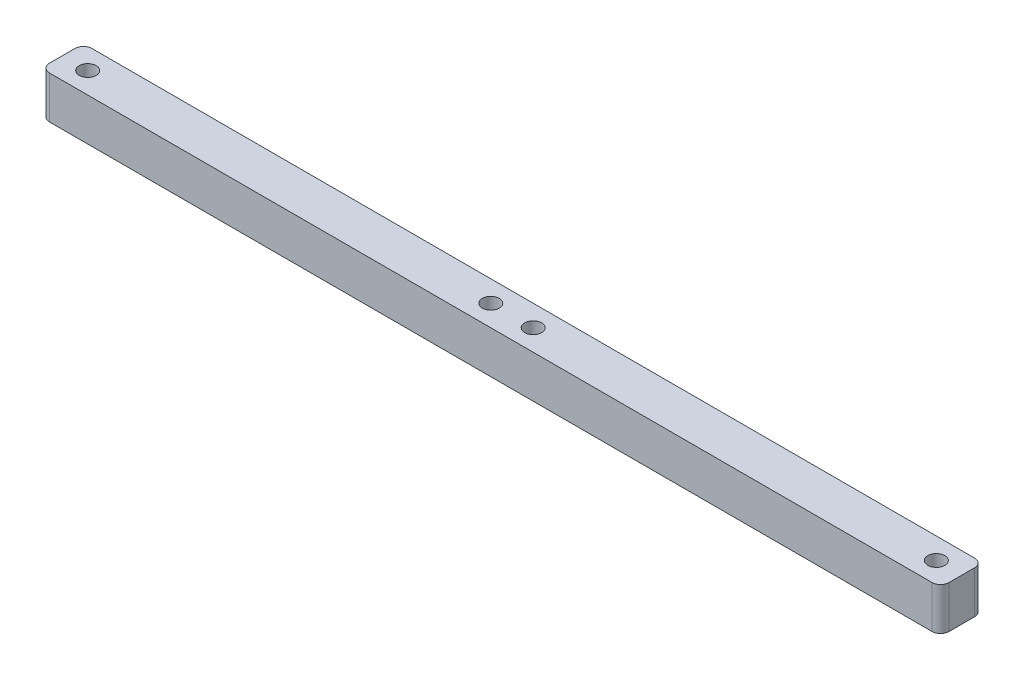
ISO-10303-21;
HEADER;
FILE_DESCRIPTION(('STEP AP214'),'2;1');
FILE_NAME('part.step','',(''),(''),'','','');
FILE_SCHEMA(('AUTOMOTIVE_DESIGN { 1 0 10303 214 1 1 1 1 }'));
ENDSEC;
DATA;
#1=APPLICATION_CONTEXT('core data for automotive mechanical design processes');
#2=APPLICATION_PROTOCOL_DEFINITION('international standard','automotive_design',2000,#1);
#3=PRODUCT_CONTEXT('',#1,'mechanical');
#4=PRODUCT('Part','Part','',(#3));
#5=PRODUCT_RELATED_PRODUCT_CATEGORY('part','',(#4));
#6=PRODUCT_DEFINITION_FORMATION('','',#4);
#7=PRODUCT_DEFINITION_CONTEXT('part definition',#1,'design');
#8=PRODUCT_DEFINITION('design','',#6,#7);
#9=PRODUCT_DEFINITION_SHAPE('','',#8);
#10=(LENGTH_UNIT() NAMED_UNIT(*) SI_UNIT(.MILLI.,.METRE.));
#11=(NAMED_UNIT(*) PLANE_ANGLE_UNIT() SI_UNIT($,.RADIAN.));
#12=(NAMED_UNIT(*) SI_UNIT($,.STERADIAN.) SOLID_ANGLE_UNIT());
#13=UNCERTAINTY_MEASURE_WITH_UNIT(LENGTH_MEASURE(1.E-05),#10,'distance_accuracy_value','');
#14=(GEOMETRIC_REPRESENTATION_CONTEXT(3) GLOBAL_UNCERTAINTY_ASSIGNED_CONTEXT((#13)) GLOBAL_UNIT_ASSIGNED_CONTEXT((#10,
#11,#12)) REPRESENTATION_CONTEXT('',''));
#15=CARTESIAN_POINT('',(0.,0.,0.));
#16=DIRECTION('',(0.,0.,1.));
#17=DIRECTION('',(1.,0.,0.));
#18=AXIS2_PLACEMENT_3D('',#15,#16,#17);
#19=CARTESIAN_POINT('',(53.,5.,-2.5));
#20=DIRECTION('',(-1.,0.,0.));
#21=DIRECTION('',(0.,0.,1.));
#22=AXIS2_PLACEMENT_3D('',#19,#20,#21);
#23=PLANE('',#22);
#24=DIRECTION('',(0.,0.,-1.));
#25=VECTOR('',#24,1.);
#26=CARTESIAN_POINT('',(53.,0.,-2.5));
#27=LINE('',#26,#25);
#28=CARTESIAN_POINT('',(53.,0.,1.5));
#29=VERTEX_POINT('',#28);
#30=CARTESIAN_POINT('',(53.,0.,-1.5));
#31=VERTEX_POINT('',#30);
#32=EDGE_CURVE('E134',#29,#31,#27,.T.);
#33=ORIENTED_EDGE('',*,*,#32,.T.);
#34=DIRECTION('',(0.,-1.,0.));
#35=VECTOR('',#34,1.);
#36=CARTESIAN_POINT('',(53.,5.,-1.5));
#37=LINE('',#36,#35);
#38=CARTESIAN_POINT('',(53.,5.,-1.5));
#39=VERTEX_POINT('',#38);
#40=EDGE_CURVE('E58',#31,#39,#37,.F.);
#41=ORIENTED_EDGE('',*,*,#40,.T.);
#42=DIRECTION('',(0.,0.,-1.));
#43=VECTOR('',#42,1.);
#44=CARTESIAN_POINT('',(53.,5.,-2.5));
#45=LINE('',#44,#43);
#46=CARTESIAN_POINT('',(53.,5.,1.5));
#47=VERTEX_POINT('',#46);
#48=EDGE_CURVE('E132',#47,#39,#45,.T.);
#49=ORIENTED_EDGE('',*,*,#48,.F.);
#50=DIRECTION('',(0.,-1.,0.));
#51=VECTOR('',#50,1.);
#52=CARTESIAN_POINT('',(53.,5.,1.5));
#53=LINE('',#52,#51);
#54=EDGE_CURVE('E156',#47,#29,#53,.T.);
#55=ORIENTED_EDGE('',*,*,#54,.T.);
#56=EDGE_LOOP('',(#33,#41,#49,#55));
#57=FACE_BOUND('',#56,.T.);
#58=ADVANCED_FACE('F37',(#57),#23,.F.);
#59=CARTESIAN_POINT('',(-53.,5.,-2.5));
#60=DIRECTION('',(0.,0.,1.));
#61=DIRECTION('',(1.,0.,0.));
#62=AXIS2_PLACEMENT_3D('',#59,#60,#61);
#63=PLANE('',#62);
#64=DIRECTION('',(-1.,0.,0.));
#65=VECTOR('',#64,1.);
#66=CARTESIAN_POINT('',(-53.,5.,-2.5));
#67=LINE('',#66,#65);
#68=CARTESIAN_POINT('',(52.,5.,-2.5));
#69=VERTEX_POINT('',#68);
#70=CARTESIAN_POINT('',(-52.,5.,-2.5));
#71=VERTEX_POINT('',#70);
#72=EDGE_CURVE('E165',#69,#71,#67,.T.);
#73=ORIENTED_EDGE('',*,*,#72,.F.);
#74=DIRECTION('',(0.,-1.,0.));
#75=VECTOR('',#74,1.);
#76=CARTESIAN_POINT('',(52.,5.,-2.5));
#77=LINE('',#76,#75);
#78=CARTESIAN_POINT('',(52.,0.,-2.5));
#79=VERTEX_POINT('',#78);
#80=EDGE_CURVE('E149',#69,#79,#77,.T.);
#81=ORIENTED_EDGE('',*,*,#80,.T.);
#82=DIRECTION('',(-1.,0.,0.));
#83=VECTOR('',#82,1.);
#84=CARTESIAN_POINT('',(-53.,0.,-2.5));
#85=LINE('',#84,#83);
#86=CARTESIAN_POINT('',(-52.,0.,-2.5));
#87=VERTEX_POINT('',#86);
#88=EDGE_CURVE('E130',#79,#87,#85,.T.);
#89=ORIENTED_EDGE('',*,*,#88,.T.);
#90=DIRECTION('',(0.,-1.,0.));
#91=VECTOR('',#90,1.);
#92=CARTESIAN_POINT('',(-52.,5.,-2.5));
#93=LINE('',#92,#91);
#94=EDGE_CURVE('E111',#87,#71,#93,.F.);
#95=ORIENTED_EDGE('',*,*,#94,.T.);
#96=EDGE_LOOP('',(#73,#81,#89,#95));
#97=FACE_BOUND('',#96,.T.);
#98=ADVANCED_FACE('F169',(#97),#63,.F.);
#99=CARTESIAN_POINT('',(-53.,5.,-2.5));
#100=DIRECTION('',(1.,0.,0.));
#101=DIRECTION('',(0.,0.,-1.));
#102=AXIS2_PLACEMENT_3D('',#99,#100,#101);
#103=PLANE('',#102);
#104=DIRECTION('',(0.,0.,1.));
#105=VECTOR('',#104,1.);
#106=CARTESIAN_POINT('',(-53.,5.,-2.5));
#107=LINE('',#106,#105);
#108=CARTESIAN_POINT('',(-53.,5.,-1.5));
#109=VERTEX_POINT('',#108);
#110=CARTESIAN_POINT('',(-53.,5.,1.5));
#111=VERTEX_POINT('',#110);
#112=EDGE_CURVE('E124',#109,#111,#107,.T.);
#113=ORIENTED_EDGE('',*,*,#112,.F.);
#114=DIRECTION('',(0.,-1.,0.));
#115=VECTOR('',#114,1.);
#116=CARTESIAN_POINT('',(-53.,5.,-1.5));
#117=LINE('',#116,#115);
#118=CARTESIAN_POINT('',(-53.,0.,-1.5));
#119=VERTEX_POINT('',#118);
#120=EDGE_CURVE('E109',#109,#119,#117,.T.);
#121=ORIENTED_EDGE('',*,*,#120,.T.);
#122=DIRECTION('',(0.,0.,1.));
#123=VECTOR('',#122,1.);
#124=CARTESIAN_POINT('',(-53.,0.,-2.5));
#125=LINE('',#124,#123);
#126=CARTESIAN_POINT('',(-53.,0.,1.5));
#127=VERTEX_POINT('',#126);
#128=EDGE_CURVE('E121',#119,#127,#125,.T.);
#129=ORIENTED_EDGE('',*,*,#128,.T.);
#130=DIRECTION('',(0.,-1.,0.));
#131=VECTOR('',#130,1.);
#132=CARTESIAN_POINT('',(-53.,5.,1.5));
#133=LINE('',#132,#131);
#134=EDGE_CURVE('E125',#127,#111,#133,.F.);
#135=ORIENTED_EDGE('',*,*,#134,.T.);
#136=EDGE_LOOP('',(#113,#121,#129,#135));
#137=FACE_BOUND('',#136,.T.);
#138=ADVANCED_FACE('F120',(#137),#103,.F.);
#139=CARTESIAN_POINT('',(-53.,5.,2.5));
#140=DIRECTION('',(0.,0.,-1.));
#141=DIRECTION('',(-1.,0.,0.));
#142=AXIS2_PLACEMENT_3D('',#139,#140,#141);
#143=PLANE('',#142);
#144=DIRECTION('',(1.,0.,0.));
#145=VECTOR('',#144,1.);
#146=CARTESIAN_POINT('',(-53.,0.,2.5));
#147=LINE('',#146,#145);
#148=CARTESIAN_POINT('',(-52.,0.,2.5));
#149=VERTEX_POINT('',#148);
#150=CARTESIAN_POINT('',(52.,0.,2.5));
#151=VERTEX_POINT('',#150);
#152=EDGE_CURVE('E129',#149,#151,#147,.T.);
#153=ORIENTED_EDGE('',*,*,#152,.T.);
#154=DIRECTION('',(0.,-1.,0.));
#155=VECTOR('',#154,1.);
#156=CARTESIAN_POINT('',(52.,5.,2.5));
#157=LINE('',#156,#155);
#158=CARTESIAN_POINT('',(52.,5.,2.5));
#159=VERTEX_POINT('',#158);
#160=EDGE_CURVE('E11',#151,#159,#157,.F.);
#161=ORIENTED_EDGE('',*,*,#160,.T.);
#162=DIRECTION('',(1.,0.,0.));
#163=VECTOR('',#162,1.);
#164=CARTESIAN_POINT('',(-53.,5.,2.5));
#165=LINE('',#164,#163);
#166=CARTESIAN_POINT('',(-52.,5.,2.5));
#167=VERTEX_POINT('',#166);
#168=EDGE_CURVE('E138',#167,#159,#165,.T.);
#169=ORIENTED_EDGE('',*,*,#168,.F.);
#170=DIRECTION('',(0.,-1.,0.));
#171=VECTOR('',#170,1.);
#172=CARTESIAN_POINT('',(-52.,5.,2.5));
#173=LINE('',#172,#171);
#174=EDGE_CURVE('E146',#167,#149,#173,.T.);
#175=ORIENTED_EDGE('',*,*,#174,.T.);
#176=EDGE_LOOP('',(#153,#161,#169,#175));
#177=FACE_BOUND('',#176,.T.);
#178=ADVANCED_FACE('F207',(#177),#143,.F.);
#179=CARTESIAN_POINT('',(0.,5.,0.));
#180=DIRECTION('',(0.,1.,0.));
#181=DIRECTION('',(0.,0.,1.));
#182=AXIS2_PLACEMENT_3D('',#179,#180,#181);
#183=PLANE('',#182);
#184=CARTESIAN_POINT('',(-50.,5.,0.));
#185=DIRECTION('',(0.,1.,0.));
#186=DIRECTION('',(0.,0.,1.));
#187=AXIS2_PLACEMENT_3D('',#184,#185,#186);
#188=CIRCLE('',#187,0.999999999999998);
#189=CARTESIAN_POINT('',(-50.,5.,0.999999999999999));
#190=VERTEX_POINT('',#189);
#191=EDGE_CURVE('E176',#190,#190,#188,.T.);
#192=ORIENTED_EDGE('',*,*,#191,.F.);
#193=EDGE_LOOP('',(#192));
#194=FACE_BOUND('',#193,.T.);
#195=CARTESIAN_POINT('',(2.5,5.,0.));
#196=DIRECTION('',(0.,1.,0.));
#197=DIRECTION('',(0.,0.,1.));
#198=AXIS2_PLACEMENT_3D('',#195,#196,#197);
#199=CIRCLE('',#198,1.);
#200=CARTESIAN_POINT('',(2.5,5.,0.999999999999999));
#201=VERTEX_POINT('',#200);
#202=EDGE_CURVE('E186',#201,#201,#199,.T.);
#203=ORIENTED_EDGE('',*,*,#202,.F.);
#204=EDGE_LOOP('',(#203));
#205=FACE_BOUND('',#204,.T.);
#206=CARTESIAN_POINT('',(-2.5,5.,0.));
#207=DIRECTION('',(0.,1.,0.));
#208=DIRECTION('',(0.,0.,1.));
#209=AXIS2_PLACEMENT_3D('',#206,#207,#208);
#210=CIRCLE('',#209,1.);
#211=CARTESIAN_POINT('',(-2.5,5.,1.));
#212=VERTEX_POINT('',#211);
#213=EDGE_CURVE('E185',#212,#212,#210,.T.);
#214=ORIENTED_EDGE('',*,*,#213,.F.);
#215=EDGE_LOOP('',(#214));
#216=FACE_BOUND('',#215,.T.);
#217=CARTESIAN_POINT('',(50.,5.,0.));
#218=DIRECTION('',(0.,1.,0.));
#219=DIRECTION('',(0.,0.,1.));
#220=AXIS2_PLACEMENT_3D('',#217,#218,#219);
#221=CIRCLE('',#220,0.999999999999998);
#222=CARTESIAN_POINT('',(50.,5.,0.999999999999998));
#223=VERTEX_POINT('',#222);
#224=EDGE_CURVE('E192',#223,#223,#221,.T.);
#225=ORIENTED_EDGE('',*,*,#224,.F.);
#226=EDGE_LOOP('',(#225));
#227=FACE_BOUND('',#226,.T.);
#228=ORIENTED_EDGE('',*,*,#48,.T.);
#229=CARTESIAN_POINT('',(52.,5.,-1.5));
#230=DIRECTION('',(0.,1.,0.));
#231=DIRECTION('',(0.,0.,1.));
#232=AXIS2_PLACEMENT_3D('',#229,#230,#231);
#233=CIRCLE('',#232,1.);
#234=EDGE_CURVE('E45',#39,#69,#233,.T.);
#235=ORIENTED_EDGE('',*,*,#234,.T.);
#236=ORIENTED_EDGE('',*,*,#72,.T.);
#237=CARTESIAN_POINT('',(-52.,5.,-1.5));
#238=DIRECTION('',(0.,1.,0.));
#239=DIRECTION('',(0.,0.,1.));
#240=AXIS2_PLACEMENT_3D('',#237,#238,#239);
#241=CIRCLE('',#240,1.);
#242=EDGE_CURVE('E144',#71,#109,#241,.T.);
#243=ORIENTED_EDGE('',*,*,#242,.T.);
#244=ORIENTED_EDGE('',*,*,#112,.T.);
#245=CARTESIAN_POINT('',(-52.,5.,1.5));
#246=DIRECTION('',(0.,1.,0.));
#247=DIRECTION('',(0.,0.,1.));
#248=AXIS2_PLACEMENT_3D('',#245,#246,#247);
#249=CIRCLE('',#248,1.);
#250=EDGE_CURVE('E142',#111,#167,#249,.T.);
#251=ORIENTED_EDGE('',*,*,#250,.T.);
#252=ORIENTED_EDGE('',*,*,#168,.T.);
#253=CARTESIAN_POINT('',(52.,5.,1.5));
#254=DIRECTION('',(0.,1.,0.));
#255=DIRECTION('',(0.,0.,1.));
#256=AXIS2_PLACEMENT_3D('',#253,#254,#255);
#257=CIRCLE('',#256,1.);
#258=EDGE_CURVE('E160',#159,#47,#257,.T.);
#259=ORIENTED_EDGE('',*,*,#258,.T.);
#260=EDGE_LOOP('',(#228,#235,#236,#243,#244,#251,#252,#259));
#261=FACE_BOUND('',#260,.T.);
#262=ADVANCED_FACE('F164',(#194,#205,#216,#227,#261),#183,.T.);
#263=CARTESIAN_POINT('',(0.,0.,0.));
#264=DIRECTION('',(0.,1.,0.));
#265=DIRECTION('',(0.,0.,1.));
#266=AXIS2_PLACEMENT_3D('',#263,#264,#265);
#267=PLANE('',#266);
#268=CARTESIAN_POINT('',(-50.,0.,0.));
#269=DIRECTION('',(0.,1.,0.));
#270=DIRECTION('',(0.,0.,1.));
#271=AXIS2_PLACEMENT_3D('',#268,#269,#270);
#272=CIRCLE('',#271,0.999999999999998);
#273=CARTESIAN_POINT('',(-50.,0.,0.999999999999999));
#274=VERTEX_POINT('',#273);
#275=EDGE_CURVE('E174',#274,#274,#272,.T.);
#276=ORIENTED_EDGE('',*,*,#275,.T.);
#277=EDGE_LOOP('',(#276));
#278=FACE_BOUND('',#277,.T.);
#279=CARTESIAN_POINT('',(2.5,0.,0.));
#280=DIRECTION('',(0.,1.,0.));
#281=DIRECTION('',(0.,0.,1.));
#282=AXIS2_PLACEMENT_3D('',#279,#280,#281);
#283=CIRCLE('',#282,1.);
#284=CARTESIAN_POINT('',(2.5,0.,0.999999999999999));
#285=VERTEX_POINT('',#284);
#286=EDGE_CURVE('E195',#285,#285,#283,.T.);
#287=ORIENTED_EDGE('',*,*,#286,.T.);
#288=EDGE_LOOP('',(#287));
#289=FACE_BOUND('',#288,.T.);
#290=CARTESIAN_POINT('',(-2.5,0.,0.));
#291=DIRECTION('',(0.,1.,0.));
#292=DIRECTION('',(0.,0.,1.));
#293=AXIS2_PLACEMENT_3D('',#290,#291,#292);
#294=CIRCLE('',#293,1.);
#295=CARTESIAN_POINT('',(-2.5,0.,1.));
#296=VERTEX_POINT('',#295);
#297=EDGE_CURVE('E182',#296,#296,#294,.T.);
#298=ORIENTED_EDGE('',*,*,#297,.T.);
#299=EDGE_LOOP('',(#298));
#300=FACE_BOUND('',#299,.T.);
#301=CARTESIAN_POINT('',(50.,0.,0.));
#302=DIRECTION('',(0.,1.,0.));
#303=DIRECTION('',(0.,0.,1.));
#304=AXIS2_PLACEMENT_3D('',#301,#302,#303);
#305=CIRCLE('',#304,0.999999999999998);
#306=CARTESIAN_POINT('',(50.,0.,0.999999999999998));
#307=VERTEX_POINT('',#306);
#308=EDGE_CURVE('E189',#307,#307,#305,.T.);
#309=ORIENTED_EDGE('',*,*,#308,.T.);
#310=EDGE_LOOP('',(#309));
#311=FACE_BOUND('',#310,.T.);
#312=ORIENTED_EDGE('',*,*,#88,.F.);
#313=CARTESIAN_POINT('',(52.,0.,-1.5));
#314=DIRECTION('',(0.,1.,0.));
#315=DIRECTION('',(0.,0.,1.));
#316=AXIS2_PLACEMENT_3D('',#313,#314,#315);
#317=CIRCLE('',#316,1.);
#318=EDGE_CURVE('E154',#79,#31,#317,.F.);
#319=ORIENTED_EDGE('',*,*,#318,.T.);
#320=ORIENTED_EDGE('',*,*,#32,.F.);
#321=CARTESIAN_POINT('',(52.,0.,1.5));
#322=DIRECTION('',(0.,1.,0.));
#323=DIRECTION('',(0.,0.,1.));
#324=AXIS2_PLACEMENT_3D('',#321,#322,#323);
#325=CIRCLE('',#324,1.);
#326=EDGE_CURVE('E152',#29,#151,#325,.F.);
#327=ORIENTED_EDGE('',*,*,#326,.T.);
#328=ORIENTED_EDGE('',*,*,#152,.F.);
#329=CARTESIAN_POINT('',(-52.,0.,1.5));
#330=DIRECTION('',(0.,1.,0.));
#331=DIRECTION('',(0.,0.,1.));
#332=AXIS2_PLACEMENT_3D('',#329,#330,#331);
#333=CIRCLE('',#332,1.);
#334=EDGE_CURVE('E115',#149,#127,#333,.F.);
#335=ORIENTED_EDGE('',*,*,#334,.T.);
#336=ORIENTED_EDGE('',*,*,#128,.F.);
#337=CARTESIAN_POINT('',(-52.,0.,-1.5));
#338=DIRECTION('',(0.,1.,0.));
#339=DIRECTION('',(0.,0.,1.));
#340=AXIS2_PLACEMENT_3D('',#337,#338,#339);
#341=CIRCLE('',#340,1.);
#342=EDGE_CURVE('E105',#119,#87,#341,.F.);
#343=ORIENTED_EDGE('',*,*,#342,.T.);
#344=EDGE_LOOP('',(#312,#319,#320,#327,#328,#335,#336,#343));
#345=FACE_BOUND('',#344,.T.);
#346=ADVANCED_FACE('F127',(#278,#289,#300,#311,#345),#267,.F.);
#347=CARTESIAN_POINT('',(-52.,5.,-1.5));
#348=DIRECTION('',(0.,-1.,0.));
#349=DIRECTION('',(0.,0.,-1.));
#350=AXIS2_PLACEMENT_3D('',#347,#348,#349);
#351=CYLINDRICAL_SURFACE('',#350,1.);
#352=ORIENTED_EDGE('',*,*,#242,.F.);
#353=ORIENTED_EDGE('',*,*,#94,.F.);
#354=ORIENTED_EDGE('',*,*,#342,.F.);
#355=ORIENTED_EDGE('',*,*,#120,.F.);
#356=EDGE_LOOP('',(#352,#353,#354,#355));
#357=FACE_BOUND('',#356,.T.);
#358=ADVANCED_FACE('F108',(#357),#351,.T.);
#359=CARTESIAN_POINT('',(-52.,5.,1.5));
#360=DIRECTION('',(0.,-1.,0.));
#361=DIRECTION('',(0.,0.,-1.));
#362=AXIS2_PLACEMENT_3D('',#359,#360,#361);
#363=CYLINDRICAL_SURFACE('',#362,1.);
#364=ORIENTED_EDGE('',*,*,#250,.F.);
#365=ORIENTED_EDGE('',*,*,#134,.F.);
#366=ORIENTED_EDGE('',*,*,#334,.F.);
#367=ORIENTED_EDGE('',*,*,#174,.F.);
#368=EDGE_LOOP('',(#364,#365,#366,#367));
#369=FACE_BOUND('',#368,.T.);
#370=ADVANCED_FACE('F240',(#369),#363,.T.);
#371=CARTESIAN_POINT('',(52.,5.,-1.5));
#372=DIRECTION('',(0.,-1.,0.));
#373=DIRECTION('',(0.,0.,-1.));
#374=AXIS2_PLACEMENT_3D('',#371,#372,#373);
#375=CYLINDRICAL_SURFACE('',#374,1.);
#376=ORIENTED_EDGE('',*,*,#234,.F.);
#377=ORIENTED_EDGE('',*,*,#40,.F.);
#378=ORIENTED_EDGE('',*,*,#318,.F.);
#379=ORIENTED_EDGE('',*,*,#80,.F.);
#380=EDGE_LOOP('',(#376,#377,#378,#379));
#381=FACE_BOUND('',#380,.T.);
#382=ADVANCED_FACE('F171',(#381),#375,.T.);
#383=CARTESIAN_POINT('',(52.,5.,1.5));
#384=DIRECTION('',(0.,-1.,0.));
#385=DIRECTION('',(0.,0.,-1.));
#386=AXIS2_PLACEMENT_3D('',#383,#384,#385);
#387=CYLINDRICAL_SURFACE('',#386,1.);
#388=ORIENTED_EDGE('',*,*,#258,.F.);
#389=ORIENTED_EDGE('',*,*,#160,.F.);
#390=ORIENTED_EDGE('',*,*,#326,.F.);
#391=ORIENTED_EDGE('',*,*,#54,.F.);
#392=EDGE_LOOP('',(#388,#389,#390,#391));
#393=FACE_BOUND('',#392,.T.);
#394=ADVANCED_FACE('F39',(#393),#387,.T.);
#395=CARTESIAN_POINT('',(50.,0.,0.));
#396=DIRECTION('',(0.,1.,0.));
#397=DIRECTION('',(0.,0.,1.));
#398=AXIS2_PLACEMENT_3D('',#395,#396,#397);
#399=CYLINDRICAL_SURFACE('',#398,0.999999999999998);
#400=ORIENTED_EDGE('',*,*,#308,.F.);
#401=EDGE_LOOP('',(#400));
#402=FACE_BOUND('',#401,.T.);
#403=ORIENTED_EDGE('',*,*,#224,.T.);
#404=EDGE_LOOP('',(#403));
#405=FACE_BOUND('',#404,.T.);
#406=ADVANCED_FACE('F215',(#402,#405),#399,.F.);
#407=CARTESIAN_POINT('',(-2.5,0.,0.));
#408=DIRECTION('',(0.,1.,0.));
#409=DIRECTION('',(0.,0.,1.));
#410=AXIS2_PLACEMENT_3D('',#407,#408,#409);
#411=CYLINDRICAL_SURFACE('',#410,1.);
#412=ORIENTED_EDGE('',*,*,#297,.F.);
#413=EDGE_LOOP('',(#412));
#414=FACE_BOUND('',#413,.T.);
#415=ORIENTED_EDGE('',*,*,#213,.T.);
#416=EDGE_LOOP('',(#415));
#417=FACE_BOUND('',#416,.T.);
#418=ADVANCED_FACE('F217',(#414,#417),#411,.F.);
#419=CARTESIAN_POINT('',(2.5,0.,0.));
#420=DIRECTION('',(0.,1.,0.));
#421=DIRECTION('',(0.,0.,1.));
#422=AXIS2_PLACEMENT_3D('',#419,#420,#421);
#423=CYLINDRICAL_SURFACE('',#422,1.);
#424=ORIENTED_EDGE('',*,*,#286,.F.);
#425=EDGE_LOOP('',(#424));
#426=FACE_BOUND('',#425,.T.);
#427=ORIENTED_EDGE('',*,*,#202,.T.);
#428=EDGE_LOOP('',(#427));
#429=FACE_BOUND('',#428,.T.);
#430=ADVANCED_FACE('F224',(#426,#429),#423,.F.);
#431=CARTESIAN_POINT('',(-50.,0.,0.));
#432=DIRECTION('',(0.,1.,0.));
#433=DIRECTION('',(0.,0.,1.));
#434=AXIS2_PLACEMENT_3D('',#431,#432,#433);
#435=CYLINDRICAL_SURFACE('',#434,0.999999999999998);
#436=ORIENTED_EDGE('',*,*,#275,.F.);
#437=EDGE_LOOP('',(#436));
#438=FACE_BOUND('',#437,.T.);
#439=ORIENTED_EDGE('',*,*,#191,.T.);
#440=EDGE_LOOP('',(#439));
#441=FACE_BOUND('',#440,.T.);
#442=ADVANCED_FACE('F203',(#438,#441),#435,.F.);
#443=CLOSED_SHELL('',(#58,#98,#138,#178,#262,#346,#358,#370,#382,#394,#406,#418,#430,#442));
#444=MANIFOLD_SOLID_BREP('B2',#443);
#445=ADVANCED_BREP_SHAPE_REPRESENTATION('',(#18,#444),#14);
#446=SHAPE_DEFINITION_REPRESENTATION(#9,#445);
ENDSEC;
END-ISO-10303-21;
